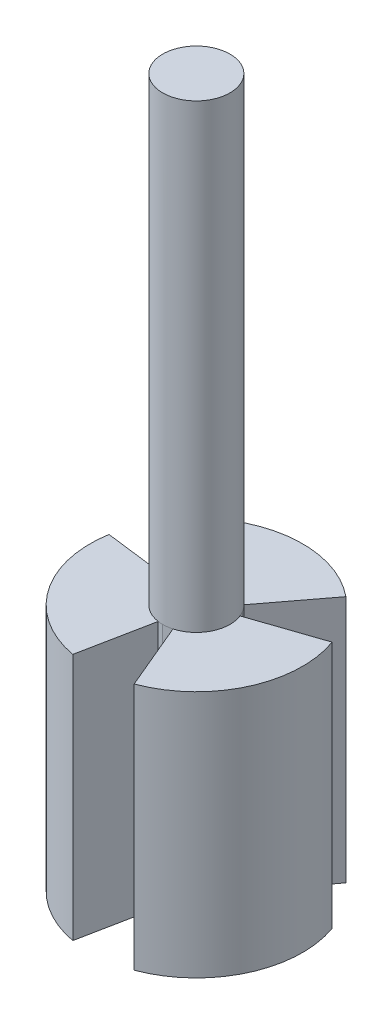
ISO-10303-21;
HEADER;
FILE_DESCRIPTION(('STEP AP214'),'2;1');
FILE_NAME('part.step','',(''),(''),'','','');
FILE_SCHEMA(('AUTOMOTIVE_DESIGN { 1 0 10303 214 1 1 1 1 }'));
ENDSEC;
DATA;
#1=APPLICATION_CONTEXT('core data for automotive mechanical design processes');
#2=APPLICATION_PROTOCOL_DEFINITION('international standard','automotive_design',2000,#1);
#3=PRODUCT_CONTEXT('',#1,'mechanical');
#4=PRODUCT('Part','Part','',(#3));
#5=PRODUCT_RELATED_PRODUCT_CATEGORY('part','',(#4));
#6=PRODUCT_DEFINITION_FORMATION('','',#4);
#7=PRODUCT_DEFINITION_CONTEXT('part definition',#1,'design');
#8=PRODUCT_DEFINITION('design','',#6,#7);
#9=PRODUCT_DEFINITION_SHAPE('','',#8);
#10=(LENGTH_UNIT() NAMED_UNIT(*) SI_UNIT(.MILLI.,.METRE.));
#11=(NAMED_UNIT(*) PLANE_ANGLE_UNIT() SI_UNIT($,.RADIAN.));
#12=(NAMED_UNIT(*) SI_UNIT($,.STERADIAN.) SOLID_ANGLE_UNIT());
#13=UNCERTAINTY_MEASURE_WITH_UNIT(LENGTH_MEASURE(1.E-05),#10,'distance_accuracy_value','');
#14=(GEOMETRIC_REPRESENTATION_CONTEXT(3) GLOBAL_UNCERTAINTY_ASSIGNED_CONTEXT((#13)) GLOBAL_UNIT_ASSIGNED_CONTEXT((#10,
#11,#12)) REPRESENTATION_CONTEXT('',''));
#15=CARTESIAN_POINT('',(0.,0.,0.));
#16=DIRECTION('',(0.,0.,1.));
#17=DIRECTION('',(1.,0.,0.));
#18=AXIS2_PLACEMENT_3D('',#15,#16,#17);
#19=CARTESIAN_POINT('',(0.,70.,0.));
#20=DIRECTION('',(0.,-1.,0.));
#21=DIRECTION('',(0.,0.,-1.));
#22=AXIS2_PLACEMENT_3D('',#19,#20,#21);
#23=CYLINDRICAL_SURFACE('',#22,30.);
#24=DIRECTION('',(0.,-1.,0.));
#25=VECTOR('',#24,1.);
#26=CARTESIAN_POINT('',(-22.8717471072358,70.,-19.4134794476068));
#27=LINE('',#26,#25);
#28=CARTESIAN_POINT('',(-22.8717471072358,70.,-19.4134794476068));
#29=VERTEX_POINT('',#28);
#30=CARTESIAN_POINT('',(-22.8717471072358,0.,-19.4134794476068));
#31=VERTEX_POINT('',#30);
#32=EDGE_CURVE('E239',#29,#31,#27,.T.);
#33=ORIENTED_EDGE('',*,*,#32,.F.);
#34=CARTESIAN_POINT('',(0.,70.,0.));
#35=DIRECTION('',(0.,-1.,0.));
#36=DIRECTION('',(0.,0.,-1.));
#37=AXIS2_PLACEMENT_3D('',#34,#35,#36);
#38=CIRCLE('',#37,30.);
#39=CARTESIAN_POINT('',(19.0618079007288,70.,-23.1656530137985));
#40=VERTEX_POINT('',#39);
#41=EDGE_CURVE('E294',#29,#40,#38,.T.);
#42=ORIENTED_EDGE('',*,*,#41,.T.);
#43=DIRECTION('',(0.,-1.,0.));
#44=VECTOR('',#43,1.);
#45=CARTESIAN_POINT('',(19.0618079007288,70.,-23.1656530137985));
#46=LINE('',#45,#44);
#47=CARTESIAN_POINT('',(19.0618079007288,0.,-23.1656530137985));
#48=VERTEX_POINT('',#47);
#49=EDGE_CURVE('E193',#48,#40,#46,.F.);
#50=ORIENTED_EDGE('',*,*,#49,.F.);
#51=CARTESIAN_POINT('',(0.,0.,0.));
#52=DIRECTION('',(0.,-1.,0.));
#53=DIRECTION('',(0.,0.,-1.));
#54=AXIS2_PLACEMENT_3D('',#51,#52,#53);
#55=CIRCLE('',#54,30.);
#56=EDGE_CURVE('E299',#31,#48,#55,.T.);
#57=ORIENTED_EDGE('',*,*,#56,.F.);
#58=EDGE_LOOP('',(#33,#42,#50,#57));
#59=FACE_BOUND('',#58,.T.);
#60=ADVANCED_FACE('F41',(#59),#23,.T.);
#61=DIRECTION('',(0.,-1.,0.));
#62=VECTOR('',#61,1.);
#63=CARTESIAN_POINT('',(28.2484399310925,70.,-10.1007742999959));
#64=LINE('',#63,#62);
#65=CARTESIAN_POINT('',(28.2484399310925,70.,-10.1007742999959));
#66=VERTEX_POINT('',#65);
#67=CARTESIAN_POINT('',(28.2484399310925,0.,-10.1007742999959));
#68=VERTEX_POINT('',#67);
#69=EDGE_CURVE('E233',#66,#68,#64,.T.);
#70=ORIENTED_EDGE('',*,*,#69,.F.);
#71=CARTESIAN_POINT('',(10.5311400548409,70.,28.0908363909892));
#72=VERTEX_POINT('',#71);
#73=EDGE_CURVE('E295',#66,#72,#38,.T.);
#74=ORIENTED_EDGE('',*,*,#73,.T.);
#75=DIRECTION('',(0.,-1.,0.));
#76=VECTOR('',#75,1.);
#77=CARTESIAN_POINT('',(10.5311400548409,70.,28.0908363909892));
#78=LINE('',#77,#76);
#79=CARTESIAN_POINT('',(10.5311400548409,0.,28.0908363909892));
#80=VERTEX_POINT('',#79);
#81=EDGE_CURVE('E274',#80,#72,#78,.F.);
#82=ORIENTED_EDGE('',*,*,#81,.F.);
#83=EDGE_CURVE('E288',#68,#80,#55,.T.);
#84=ORIENTED_EDGE('',*,*,#83,.F.);
#85=EDGE_LOOP('',(#70,#74,#82,#84));
#86=FACE_BOUND('',#85,.T.);
#87=ADVANCED_FACE('F331',(#86),#23,.T.);
#88=CARTESIAN_POINT('',(0.,70.,0.));
#89=DIRECTION('',(0.,-1.,0.));
#90=DIRECTION('',(0.,0.,-1.));
#91=AXIS2_PLACEMENT_3D('',#88,#89,#90);
#92=PLANE('',#91);
#93=ORIENTED_EDGE('',*,*,#41,.F.);
#94=DIRECTION('',(-0.752074153309713,0.,-0.659078499060225));
#95=VECTOR('',#94,1.);
#96=CARTESIAN_POINT('',(-24.9755906548965,70.,-21.2571780264605));
#97=LINE('',#96,#95);
#98=CARTESIAN_POINT('',(-7.44814705085686,70.,-5.8970420982737));
#99=VERTEX_POINT('',#98);
#100=EDGE_CURVE('E176',#99,#29,#97,.T.);
#101=ORIENTED_EDGE('',*,*,#100,.F.);
#102=CARTESIAN_POINT('',(0.,70.,0.));
#103=DIRECTION('',(0.,-1.,0.));
#104=DIRECTION('',(0.,0.,-1.));
#105=AXIS2_PLACEMENT_3D('',#102,#103,#104);
#106=CIRCLE('',#105,9.5);
#107=CARTESIAN_POINT('',(6.64739087220726,70.,-6.78691348052231));
#108=VERTEX_POINT('',#107);
#109=EDGE_CURVE('E352',#99,#108,#106,.T.);
#110=ORIENTED_EDGE('',*,*,#109,.T.);
#111=DIRECTION('',(-0.604051845839798,0.,0.79694502165302));
#112=VECTOR('',#111,1.);
#113=CARTESIAN_POINT('',(6.64739087220726,70.,-6.78691348052231));
#114=LINE('',#113,#112);
#115=EDGE_CURVE('E209',#40,#108,#114,.T.);
#116=ORIENTED_EDGE('',*,*,#115,.F.);
#117=EDGE_LOOP('',(#93,#101,#110,#116));
#118=FACE_BOUND('',#117,.T.);
#119=ADVANCED_FACE('F397',(#118),#92,.F.);
#120=ORIENTED_EDGE('',*,*,#73,.F.);
#121=DIRECTION('',(0.946815799929131,0.,-0.321776072765767));
#122=VECTOR('',#121,1.);
#123=CARTESIAN_POINT('',(30.8970515111315,70.,-11.0009069684312));
#124=LINE('',#123,#122);
#125=CARTESIAN_POINT('',(8.83106178971976,70.,-3.50176350802729));
#126=VERTEX_POINT('',#125);
#127=EDGE_CURVE('E200',#126,#66,#124,.T.);
#128=ORIENTED_EDGE('',*,*,#127,.F.);
#129=CARTESIAN_POINT('',(2.55394405131584,70.,9.15026610447742));
#130=VERTEX_POINT('',#129);
#131=EDGE_CURVE('E303',#126,#130,#106,.T.);
#132=ORIENTED_EDGE('',*,*,#131,.T.);
#133=DIRECTION('',(-0.388148711251165,0.,-0.921596754526653));
#134=VECTOR('',#133,1.);
#135=CARTESIAN_POINT('',(2.55394405131584,70.,9.15026610447742));
#136=LINE('',#135,#134);
#137=EDGE_CURVE('E242',#72,#130,#136,.T.);
#138=ORIENTED_EDGE('',*,*,#137,.F.);
#139=EDGE_LOOP('',(#120,#128,#132,#138));
#140=FACE_BOUND('',#139,.T.);
#141=ADVANCED_FACE('F340',(#140),#92,.F.);
#142=CARTESIAN_POINT('',(0.,200.,0.));
#143=DIRECTION('',(0.,-1.,0.));
#144=DIRECTION('',(0.,0.,-1.));
#145=AXIS2_PLACEMENT_3D('',#142,#143,#144);
#146=CYLINDRICAL_SURFACE('',#145,9.5);
#147=CARTESIAN_POINT('',(0.,200.,0.));
#148=DIRECTION('',(0.,1.,0.));
#149=DIRECTION('',(0.,0.,1.));
#150=AXIS2_PLACEMENT_3D('',#147,#148,#149);
#151=CIRCLE('',#150,9.5);
#152=CARTESIAN_POINT('',(0.,200.,9.5));
#153=VERTEX_POINT('',#152);
#154=EDGE_CURVE('E293',#153,#153,#151,.T.);
#155=ORIENTED_EDGE('',*,*,#154,.F.);
#156=EDGE_LOOP('',(#155));
#157=FACE_BOUND('',#156,.T.);
#158=CARTESIAN_POINT('',(0.,70.,9.5));
#159=VERTEX_POINT('',#158);
#160=EDGE_CURVE('E304',#130,#159,#106,.T.);
#161=ORIENTED_EDGE('',*,*,#160,.F.);
#162=ORIENTED_EDGE('',*,*,#131,.F.);
#163=CARTESIAN_POINT('',(8.22724133595221,70.,-4.74999999999992));
#164=VERTEX_POINT('',#163);
#165=EDGE_CURVE('E346',#164,#126,#106,.T.);
#166=ORIENTED_EDGE('',*,*,#165,.F.);
#167=EDGE_CURVE('E348',#108,#164,#106,.T.);
#168=ORIENTED_EDGE('',*,*,#167,.F.);
#169=ORIENTED_EDGE('',*,*,#109,.F.);
#170=CARTESIAN_POINT('',(-8.22724133595214,70.,-4.75000000000004));
#171=VERTEX_POINT('',#170);
#172=EDGE_CURVE('E358',#171,#99,#106,.T.);
#173=ORIENTED_EDGE('',*,*,#172,.F.);
#174=CARTESIAN_POINT('',(-9.20133492352303,70.,-2.36335262395509));
#175=VERTEX_POINT('',#174);
#176=EDGE_CURVE('E361',#175,#171,#106,.T.);
#177=ORIENTED_EDGE('',*,*,#176,.F.);
#178=CARTESIAN_POINT('',(-1.38291473886284,70.,9.39880560630104));
#179=VERTEX_POINT('',#178);
#180=EDGE_CURVE('E364',#179,#175,#106,.T.);
#181=ORIENTED_EDGE('',*,*,#180,.F.);
#182=EDGE_CURVE('E308',#159,#179,#106,.T.);
#183=ORIENTED_EDGE('',*,*,#182,.F.);
#184=EDGE_LOOP('',(#161,#162,#166,#168,#169,#173,#177,#181,#183));
#185=FACE_BOUND('',#184,.T.);
#186=ADVANCED_FACE('F43',(#157,#185),#146,.T.);
#187=CARTESIAN_POINT('',(0.,200.,0.));
#188=DIRECTION('',(0.,1.,0.));
#189=DIRECTION('',(0.,0.,1.));
#190=AXIS2_PLACEMENT_3D('',#187,#188,#189);
#191=PLANE('',#190);
#192=ORIENTED_EDGE('',*,*,#154,.T.);
#193=EDGE_LOOP('',(#192));
#194=FACE_BOUND('',#193,.T.);
#195=ADVANCED_FACE('F388',(#194),#191,.T.);
#196=DIRECTION('',(0.,-1.,0.));
#197=VECTOR('',#196,1.);
#198=CARTESIAN_POINT('',(-29.5929479555695,70.,-4.9251833771907));
#199=LINE('',#198,#197);
#200=CARTESIAN_POINT('',(-29.5929479555695,0.,-4.9251833771907));
#201=VERTEX_POINT('',#200);
#202=CARTESIAN_POINT('',(-29.5929479555695,70.,-4.9251833771907));
#203=VERTEX_POINT('',#202);
#204=EDGE_CURVE('E236',#201,#203,#199,.F.);
#205=ORIENTED_EDGE('',*,*,#204,.F.);
#206=CARTESIAN_POINT('',(-5.37669282385651,0.,29.5142537476029));
#207=VERTEX_POINT('',#206);
#208=EDGE_CURVE('E296',#207,#201,#55,.T.);
#209=ORIENTED_EDGE('',*,*,#208,.F.);
#210=DIRECTION('',(0.,-1.,0.));
#211=VECTOR('',#210,1.);
#212=CARTESIAN_POINT('',(-5.37669282385651,70.,29.5142537476029));
#213=LINE('',#212,#211);
#214=CARTESIAN_POINT('',(-5.37669282385651,70.,29.5142537476029));
#215=VERTEX_POINT('',#214);
#216=EDGE_CURVE('E285',#215,#207,#213,.T.);
#217=ORIENTED_EDGE('',*,*,#216,.F.);
#218=EDGE_CURVE('E289',#215,#203,#38,.T.);
#219=ORIENTED_EDGE('',*,*,#218,.T.);
#220=EDGE_LOOP('',(#205,#209,#217,#219));
#221=FACE_BOUND('',#220,.T.);
#222=ADVANCED_FACE('F394',(#221),#23,.T.);
#223=ORIENTED_EDGE('',*,*,#180,.T.);
#224=DIRECTION('',(0.992200557090955,0.,0.124651732873631));
#225=VECTOR('',#224,1.);
#226=CARTESIAN_POINT('',(-9.20133492352303,70.,-2.36335262395509));
#227=LINE('',#226,#225);
#228=EDGE_CURVE('E184',#203,#175,#227,.T.);
#229=ORIENTED_EDGE('',*,*,#228,.F.);
#230=ORIENTED_EDGE('',*,*,#218,.F.);
#231=DIRECTION('',(-0.194741646619412,0.,0.980854571825997));
#232=VECTOR('',#231,1.);
#233=CARTESIAN_POINT('',(-5.92146085623477,70.,32.2580849948919));
#234=LINE('',#233,#232);
#235=EDGE_CURVE('E248',#179,#215,#234,.T.);
#236=ORIENTED_EDGE('',*,*,#235,.F.);
#237=EDGE_LOOP('',(#223,#229,#230,#236));
#238=FACE_BOUND('',#237,.T.);
#239=ADVANCED_FACE('F386',(#238),#92,.F.);
#240=CARTESIAN_POINT('',(0.,0.,0.));
#241=DIRECTION('',(0.,1.,0.));
#242=DIRECTION('',(0.,0.,1.));
#243=AXIS2_PLACEMENT_3D('',#240,#241,#242);
#244=PLANE('',#243);
#245=DIRECTION('',(0.561868897050058,0.,-0.827226294630286));
#246=VECTOR('',#245,1.);
#247=CARTESIAN_POINT('',(-7.44814705085686,0.,-5.8970420982737));
#248=LINE('',#247,#246);
#249=CARTESIAN_POINT('',(-8.22724133595214,0.,-4.75000000000004));
#250=VERTEX_POINT('',#249);
#251=CARTESIAN_POINT('',(-7.44814705085686,0.,-5.8970420982737));
#252=VERTEX_POINT('',#251);
#253=EDGE_CURVE('E164',#250,#252,#248,.T.);
#254=ORIENTED_EDGE('',*,*,#253,.T.);
#255=DIRECTION('',(-0.752074153309713,0.,-0.659078499060225));
#256=VECTOR('',#255,1.);
#257=CARTESIAN_POINT('',(-24.9755906548965,0.,-21.2571780264605));
#258=LINE('',#257,#256);
#259=EDGE_CURVE('E171',#252,#31,#258,.T.);
#260=ORIENTED_EDGE('',*,*,#259,.T.);
#261=ORIENTED_EDGE('',*,*,#56,.T.);
#262=DIRECTION('',(-0.604051845839798,0.,0.796945021653021));
#263=VECTOR('',#262,1.);
#264=CARTESIAN_POINT('',(0.954706223636675,0.,0.723628407172058));
#265=LINE('',#264,#263);
#266=CARTESIAN_POINT('',(6.64739087220726,0.,-6.78691348052232));
#267=VERTEX_POINT('',#266);
#268=EDGE_CURVE('E50',#48,#267,#265,.T.);
#269=ORIENTED_EDGE('',*,*,#268,.T.);
#270=DIRECTION('',(0.612872759870946,0.,0.790181612167842));
#271=VECTOR('',#270,1.);
#272=CARTESIAN_POINT('',(8.22724133595221,0.,-4.74999999999992));
#273=LINE('',#272,#271);
#274=CARTESIAN_POINT('',(8.22724133595221,0.,-4.74999999999992));
#275=VERTEX_POINT('',#274);
#276=EDGE_CURVE('E65',#267,#275,#273,.T.);
#277=ORIENTED_EDGE('',*,*,#276,.T.);
#278=DIRECTION('',(0.435464537303265,0.,0.900205885756838));
#279=VECTOR('',#278,1.);
#280=CARTESIAN_POINT('',(8.83106178971976,0.,-3.50176350802729));
#281=LINE('',#280,#279);
#282=CARTESIAN_POINT('',(8.83106178971976,0.,-3.50176350802729));
#283=VERTEX_POINT('',#282);
#284=EDGE_CURVE('E199',#275,#283,#281,.T.);
#285=ORIENTED_EDGE('',*,*,#284,.T.);
#286=DIRECTION('',(0.946815799929131,0.,-0.321776072765767));
#287=VECTOR('',#286,1.);
#288=CARTESIAN_POINT('',(30.8970515111315,0.,-11.0009069684312));
#289=LINE('',#288,#287);
#290=EDGE_CURVE('E204',#283,#68,#289,.T.);
#291=ORIENTED_EDGE('',*,*,#290,.T.);
#292=ORIENTED_EDGE('',*,*,#83,.T.);
#293=DIRECTION('',(-0.388148711251165,0.,-0.921596754526653));
#294=VECTOR('',#293,1.);
#295=CARTESIAN_POINT('',(-1.1040336953294,0.,0.46498563923445));
#296=LINE('',#295,#294);
#297=CARTESIAN_POINT('',(2.55394405131584,0.,9.15026610447742));
#298=VERTEX_POINT('',#297);
#299=EDGE_CURVE('E307',#80,#298,#296,.T.);
#300=ORIENTED_EDGE('',*,*,#299,.T.);
#301=DIRECTION('',(-0.990753729676166,0.,0.135672573251808));
#302=VECTOR('',#301,1.);
#303=CARTESIAN_POINT('',(0.,0.,9.5));
#304=LINE('',#303,#302);
#305=CARTESIAN_POINT('',(0.,0.,9.5));
#306=VERTEX_POINT('',#305);
#307=EDGE_CURVE('E243',#298,#306,#304,.T.);
#308=ORIENTED_EDGE('',*,*,#307,.T.);
#309=DIRECTION('',(-0.997333434353327,0.,-0.0729795911265458));
#310=VECTOR('',#309,1.);
#311=CARTESIAN_POINT('',(-1.38291473886284,0.,9.39880560630104));
#312=LINE('',#311,#310);
#313=CARTESIAN_POINT('',(-1.38291473886284,0.,9.39880560630104));
#314=VERTEX_POINT('',#313);
#315=EDGE_CURVE('E247',#306,#314,#312,.T.);
#316=ORIENTED_EDGE('',*,*,#315,.T.);
#317=DIRECTION('',(-0.194741646619412,0.,0.980854571825997));
#318=VECTOR('',#317,1.);
#319=CARTESIAN_POINT('',(-5.92146085623477,0.,32.2580849948919));
#320=LINE('',#319,#318);
#321=EDGE_CURVE('E252',#314,#207,#320,.T.);
#322=ORIENTED_EDGE('',*,*,#321,.T.);
#323=ORIENTED_EDGE('',*,*,#208,.T.);
#324=DIRECTION('',(0.992200557090955,0.,0.124651732873631));
#325=VECTOR('',#324,1.);
#326=CARTESIAN_POINT('',(0.149327471692728,0.,-1.1886140464065));
#327=LINE('',#326,#325);
#328=CARTESIAN_POINT('',(-9.20133492352303,0.,-2.36335262395509));
#329=VERTEX_POINT('',#328);
#330=EDGE_CURVE('E11',#201,#329,#327,.T.);
#331=ORIENTED_EDGE('',*,*,#330,.T.);
#332=DIRECTION('',(0.377880969805216,0.,-0.925854185419642));
#333=VECTOR('',#332,1.);
#334=CARTESIAN_POINT('',(-8.22724133595214,0.,-4.75000000000004));
#335=LINE('',#334,#333);
#336=EDGE_CURVE('E57',#329,#250,#335,.T.);
#337=ORIENTED_EDGE('',*,*,#336,.T.);
#338=EDGE_LOOP('',(#254,#260,#261,#269,#277,#285,#291,#292,#300,#308,#316,#322,#323,#331,#337));
#339=FACE_BOUND('',#338,.T.);
#340=ADVANCED_FACE('F173',(#339),#244,.F.);
#341=CARTESIAN_POINT('',(0.,70.,0.));
#342=DIRECTION('',(0.,1.,0.));
#343=DIRECTION('',(0.,0.,1.));
#344=AXIS2_PLACEMENT_3D('',#341,#342,#343);
#345=PLANE('',#344);
#346=DIRECTION('',(-0.990753729676166,0.,0.135672573251808));
#347=VECTOR('',#346,1.);
#348=CARTESIAN_POINT('',(0.,70.,9.5));
#349=LINE('',#348,#347);
#350=EDGE_CURVE('E260',#130,#159,#349,.T.);
#351=ORIENTED_EDGE('',*,*,#350,.F.);
#352=ORIENTED_EDGE('',*,*,#160,.T.);
#353=EDGE_LOOP('',(#351,#352));
#354=FACE_BOUND('',#353,.T.);
#355=ADVANCED_FACE('F417',(#354),#345,.F.);
#356=DIRECTION('',(-0.997333434353327,0.,-0.0729795911265458));
#357=VECTOR('',#356,1.);
#358=CARTESIAN_POINT('',(-1.38291473886284,70.,9.39880560630104));
#359=LINE('',#358,#357);
#360=EDGE_CURVE('E264',#159,#179,#359,.T.);
#361=ORIENTED_EDGE('',*,*,#360,.F.);
#362=ORIENTED_EDGE('',*,*,#182,.T.);
#363=EDGE_LOOP('',(#361,#362));
#364=FACE_BOUND('',#363,.T.);
#365=ADVANCED_FACE('F377',(#364),#345,.F.);
#366=CARTESIAN_POINT('',(-5.92146085623477,0.,32.2580849948919));
#367=DIRECTION('',(-0.980854571825997,0.,-0.194741646619412));
#368=DIRECTION('',(-0.194741646619412,0.,0.980854571825997));
#369=AXIS2_PLACEMENT_3D('',#366,#367,#368);
#370=PLANE('',#369);
#371=ORIENTED_EDGE('',*,*,#216,.T.);
#372=ORIENTED_EDGE('',*,*,#321,.F.);
#373=DIRECTION('',(0.,1.,0.));
#374=VECTOR('',#373,1.);
#375=CARTESIAN_POINT('',(-1.38291473886284,0.,9.39880560630104));
#376=LINE('',#375,#374);
#377=EDGE_CURVE('E270',#314,#179,#376,.T.);
#378=ORIENTED_EDGE('',*,*,#377,.T.);
#379=ORIENTED_EDGE('',*,*,#235,.T.);
#380=EDGE_LOOP('',(#371,#372,#378,#379));
#381=FACE_BOUND('',#380,.T.);
#382=ADVANCED_FACE('F380',(#381),#370,.F.);
#383=CARTESIAN_POINT('',(-1.38291473886284,0.,9.39880560630104));
#384=DIRECTION('',(0.0729795911265458,0.,-0.997333434353327));
#385=DIRECTION('',(-0.997333434353327,0.,-0.0729795911265458));
#386=AXIS2_PLACEMENT_3D('',#383,#384,#385);
#387=PLANE('',#386);
#388=ORIENTED_EDGE('',*,*,#360,.T.);
#389=ORIENTED_EDGE('',*,*,#377,.F.);
#390=ORIENTED_EDGE('',*,*,#315,.F.);
#391=DIRECTION('',(0.,1.,0.));
#392=VECTOR('',#391,1.);
#393=CARTESIAN_POINT('',(0.,0.,9.5));
#394=LINE('',#393,#392);
#395=EDGE_CURVE('E275',#306,#159,#394,.T.);
#396=ORIENTED_EDGE('',*,*,#395,.T.);
#397=EDGE_LOOP('',(#388,#389,#390,#396));
#398=FACE_BOUND('',#397,.T.);
#399=ADVANCED_FACE('F384',(#398),#387,.F.);
#400=CARTESIAN_POINT('',(0.,0.,9.5));
#401=DIRECTION('',(-0.135672573251808,0.,-0.990753729676166));
#402=DIRECTION('',(-0.990753729676166,0.,0.135672573251808));
#403=AXIS2_PLACEMENT_3D('',#400,#401,#402);
#404=PLANE('',#403);
#405=ORIENTED_EDGE('',*,*,#350,.T.);
#406=ORIENTED_EDGE('',*,*,#395,.F.);
#407=ORIENTED_EDGE('',*,*,#307,.F.);
#408=DIRECTION('',(0.,1.,0.));
#409=VECTOR('',#408,1.);
#410=CARTESIAN_POINT('',(2.55394405131584,0.,9.15026610447742));
#411=LINE('',#410,#409);
#412=EDGE_CURVE('E256',#298,#130,#411,.T.);
#413=ORIENTED_EDGE('',*,*,#412,.T.);
#414=EDGE_LOOP('',(#405,#406,#407,#413));
#415=FACE_BOUND('',#414,.T.);
#416=ADVANCED_FACE('F414',(#415),#404,.F.);
#417=CARTESIAN_POINT('',(2.55394405131584,0.,9.15026610447742));
#418=DIRECTION('',(0.921596754526653,0.,-0.388148711251165));
#419=DIRECTION('',(-0.388148711251165,0.,-0.921596754526653));
#420=AXIS2_PLACEMENT_3D('',#417,#418,#419);
#421=PLANE('',#420);
#422=ORIENTED_EDGE('',*,*,#81,.T.);
#423=ORIENTED_EDGE('',*,*,#137,.T.);
#424=ORIENTED_EDGE('',*,*,#412,.F.);
#425=ORIENTED_EDGE('',*,*,#299,.F.);
#426=EDGE_LOOP('',(#422,#423,#424,#425));
#427=FACE_BOUND('',#426,.T.);
#428=ADVANCED_FACE('F338',(#427),#421,.F.);
#429=CARTESIAN_POINT('',(0.,70.,0.));
#430=DIRECTION('',(0.,1.,0.));
#431=DIRECTION('',(0.866025403784443,0.,-0.499999999999992));
#432=AXIS2_PLACEMENT_3D('',#429,#430,#431);
#433=PLANE('',#432);
#434=DIRECTION('',(0.435464537303265,0.,0.900205885756838));
#435=VECTOR('',#434,1.);
#436=CARTESIAN_POINT('',(8.83106178971976,70.,-3.50176350802729));
#437=LINE('',#436,#435);
#438=EDGE_CURVE('E216',#164,#126,#437,.T.);
#439=ORIENTED_EDGE('',*,*,#438,.F.);
#440=ORIENTED_EDGE('',*,*,#165,.T.);
#441=EDGE_LOOP('',(#439,#440));
#442=FACE_BOUND('',#441,.T.);
#443=ADVANCED_FACE('F434',(#442),#433,.F.);
#444=DIRECTION('',(0.612872759870946,0.,0.790181612167842));
#445=VECTOR('',#444,1.);
#446=CARTESIAN_POINT('',(8.22724133595221,70.,-4.74999999999992));
#447=LINE('',#446,#445);
#448=EDGE_CURVE('E212',#108,#164,#447,.T.);
#449=ORIENTED_EDGE('',*,*,#448,.F.);
#450=ORIENTED_EDGE('',*,*,#167,.T.);
#451=EDGE_LOOP('',(#449,#450));
#452=FACE_BOUND('',#451,.T.);
#453=ADVANCED_FACE('F438',(#452),#433,.F.);
#454=CARTESIAN_POINT('',(30.8970515111315,0.,-11.0009069684312));
#455=DIRECTION('',(0.321776072765767,0.,0.946815799929131));
#456=DIRECTION('',(0.946815799929131,0.,-0.321776072765767));
#457=AXIS2_PLACEMENT_3D('',#454,#455,#456);
#458=PLANE('',#457);
#459=ORIENTED_EDGE('',*,*,#69,.T.);
#460=ORIENTED_EDGE('',*,*,#290,.F.);
#461=DIRECTION('',(0.,1.,0.));
#462=VECTOR('',#461,1.);
#463=CARTESIAN_POINT('',(8.83106178971976,0.,-3.50176350802729));
#464=LINE('',#463,#462);
#465=EDGE_CURVE('E187',#283,#126,#464,.T.);
#466=ORIENTED_EDGE('',*,*,#465,.T.);
#467=ORIENTED_EDGE('',*,*,#127,.T.);
#468=EDGE_LOOP('',(#459,#460,#466,#467));
#469=FACE_BOUND('',#468,.T.);
#470=ADVANCED_FACE('F443',(#469),#458,.F.);
#471=CARTESIAN_POINT('',(8.83106178971976,0.,-3.50176350802729));
#472=DIRECTION('',(-0.900205885756838,0.,0.435464537303265));
#473=DIRECTION('',(0.435464537303265,0.,0.900205885756838));
#474=AXIS2_PLACEMENT_3D('',#471,#472,#473);
#475=PLANE('',#474);
#476=ORIENTED_EDGE('',*,*,#438,.T.);
#477=ORIENTED_EDGE('',*,*,#465,.F.);
#478=ORIENTED_EDGE('',*,*,#284,.F.);
#479=DIRECTION('',(0.,1.,0.));
#480=VECTOR('',#479,1.);
#481=CARTESIAN_POINT('',(8.22724133595221,0.,-4.74999999999992));
#482=LINE('',#481,#480);
#483=EDGE_CURVE('E225',#275,#164,#482,.T.);
#484=ORIENTED_EDGE('',*,*,#483,.T.);
#485=EDGE_LOOP('',(#476,#477,#478,#484));
#486=FACE_BOUND('',#485,.T.);
#487=ADVANCED_FACE('F450',(#486),#475,.F.);
#488=CARTESIAN_POINT('',(8.22724133595221,0.,-4.74999999999992));
#489=DIRECTION('',(-0.790181612167842,0.,0.612872759870946));
#490=DIRECTION('',(0.612872759870946,0.,0.790181612167842));
#491=AXIS2_PLACEMENT_3D('',#488,#489,#490);
#492=PLANE('',#491);
#493=ORIENTED_EDGE('',*,*,#448,.T.);
#494=ORIENTED_EDGE('',*,*,#483,.F.);
#495=ORIENTED_EDGE('',*,*,#276,.F.);
#496=DIRECTION('',(0.,1.,0.));
#497=VECTOR('',#496,1.);
#498=CARTESIAN_POINT('',(6.64739087220726,0.,-6.78691348052231));
#499=LINE('',#498,#497);
#500=EDGE_CURVE('E208',#267,#108,#499,.T.);
#501=ORIENTED_EDGE('',*,*,#500,.T.);
#502=EDGE_LOOP('',(#493,#494,#495,#501));
#503=FACE_BOUND('',#502,.T.);
#504=ADVANCED_FACE('F453',(#503),#492,.F.);
#505=CARTESIAN_POINT('',(6.64739087220726,0.,-6.78691348052231));
#506=DIRECTION('',(-0.796945021653021,0.,-0.604051845839798));
#507=DIRECTION('',(-0.604051845839798,0.,0.796945021653021));
#508=AXIS2_PLACEMENT_3D('',#505,#506,#507);
#509=PLANE('',#508);
#510=ORIENTED_EDGE('',*,*,#49,.T.);
#511=ORIENTED_EDGE('',*,*,#115,.T.);
#512=ORIENTED_EDGE('',*,*,#500,.F.);
#513=ORIENTED_EDGE('',*,*,#268,.F.);
#514=EDGE_LOOP('',(#510,#511,#512,#513));
#515=FACE_BOUND('',#514,.T.);
#516=ADVANCED_FACE('F317',(#515),#509,.F.);
#517=CARTESIAN_POINT('',(0.,70.,0.));
#518=DIRECTION('',(0.,1.,0.));
#519=DIRECTION('',(-0.866025403784436,0.,-0.500000000000004));
#520=AXIS2_PLACEMENT_3D('',#517,#518,#519);
#521=PLANE('',#520);
#522=DIRECTION('',(0.561868897050058,0.,-0.827226294630286));
#523=VECTOR('',#522,1.);
#524=CARTESIAN_POINT('',(-7.44814705085686,70.,-5.8970420982737));
#525=LINE('',#524,#523);
#526=EDGE_CURVE('E179',#171,#99,#525,.T.);
#527=ORIENTED_EDGE('',*,*,#526,.F.);
#528=ORIENTED_EDGE('',*,*,#172,.T.);
#529=EDGE_LOOP('',(#527,#528));
#530=FACE_BOUND('',#529,.T.);
#531=ADVANCED_FACE('F459',(#530),#521,.F.);
#532=DIRECTION('',(0.377880969805216,0.,-0.925854185419642));
#533=VECTOR('',#532,1.);
#534=CARTESIAN_POINT('',(-8.22724133595214,70.,-4.75000000000004));
#535=LINE('',#534,#533);
#536=EDGE_CURVE('E154',#175,#171,#535,.T.);
#537=ORIENTED_EDGE('',*,*,#536,.F.);
#538=ORIENTED_EDGE('',*,*,#176,.T.);
#539=EDGE_LOOP('',(#537,#538));
#540=FACE_BOUND('',#539,.T.);
#541=ADVANCED_FACE('F467',(#540),#521,.F.);
#542=CARTESIAN_POINT('',(-24.9755906548965,0.,-21.2571780264605));
#543=DIRECTION('',(0.659078499060225,0.,-0.752074153309713));
#544=DIRECTION('',(-0.752074153309713,0.,-0.659078499060225));
#545=AXIS2_PLACEMENT_3D('',#542,#543,#544);
#546=PLANE('',#545);
#547=ORIENTED_EDGE('',*,*,#32,.T.);
#548=ORIENTED_EDGE('',*,*,#259,.F.);
#549=DIRECTION('',(0.,1.,0.));
#550=VECTOR('',#549,1.);
#551=CARTESIAN_POINT('',(-7.44814705085686,0.,-5.8970420982737));
#552=LINE('',#551,#550);
#553=EDGE_CURVE('E160',#252,#99,#552,.T.);
#554=ORIENTED_EDGE('',*,*,#553,.T.);
#555=ORIENTED_EDGE('',*,*,#100,.T.);
#556=EDGE_LOOP('',(#547,#548,#554,#555));
#557=FACE_BOUND('',#556,.T.);
#558=ADVANCED_FACE('F472',(#557),#546,.F.);
#559=CARTESIAN_POINT('',(-7.44814705085686,0.,-5.8970420982737));
#560=DIRECTION('',(0.827226294630285,0.,0.561868897050057));
#561=DIRECTION('',(0.561868897050058,0.,-0.827226294630286));
#562=AXIS2_PLACEMENT_3D('',#559,#560,#561);
#563=PLANE('',#562);
#564=ORIENTED_EDGE('',*,*,#526,.T.);
#565=ORIENTED_EDGE('',*,*,#553,.F.);
#566=ORIENTED_EDGE('',*,*,#253,.F.);
#567=DIRECTION('',(0.,1.,0.));
#568=VECTOR('',#567,1.);
#569=CARTESIAN_POINT('',(-8.22724133595214,0.,-4.75000000000004));
#570=LINE('',#569,#568);
#571=EDGE_CURVE('E150',#250,#171,#570,.T.);
#572=ORIENTED_EDGE('',*,*,#571,.T.);
#573=EDGE_LOOP('',(#564,#565,#566,#572));
#574=FACE_BOUND('',#573,.T.);
#575=ADVANCED_FACE('F165',(#574),#563,.F.);
#576=CARTESIAN_POINT('',(-8.22724133595214,0.,-4.75000000000004));
#577=DIRECTION('',(0.925854185419642,0.,0.377880969805216));
#578=DIRECTION('',(0.377880969805216,0.,-0.925854185419642));
#579=AXIS2_PLACEMENT_3D('',#576,#577,#578);
#580=PLANE('',#579);
#581=ORIENTED_EDGE('',*,*,#536,.T.);
#582=ORIENTED_EDGE('',*,*,#571,.F.);
#583=ORIENTED_EDGE('',*,*,#336,.F.);
#584=DIRECTION('',(0.,1.,0.));
#585=VECTOR('',#584,1.);
#586=CARTESIAN_POINT('',(-9.20133492352303,0.,-2.36335262395509));
#587=LINE('',#586,#585);
#588=EDGE_CURVE('E161',#329,#175,#587,.T.);
#589=ORIENTED_EDGE('',*,*,#588,.T.);
#590=EDGE_LOOP('',(#581,#582,#583,#589));
#591=FACE_BOUND('',#590,.T.);
#592=ADVANCED_FACE('F152',(#591),#580,.F.);
#593=CARTESIAN_POINT('',(-9.20133492352303,0.,-2.36335262395509));
#594=DIRECTION('',(-0.124651732873631,0.,0.992200557090955));
#595=DIRECTION('',(0.992200557090955,0.,0.124651732873631));
#596=AXIS2_PLACEMENT_3D('',#593,#594,#595);
#597=PLANE('',#596);
#598=ORIENTED_EDGE('',*,*,#204,.T.);
#599=ORIENTED_EDGE('',*,*,#228,.T.);
#600=ORIENTED_EDGE('',*,*,#588,.F.);
#601=ORIENTED_EDGE('',*,*,#330,.F.);
#602=EDGE_LOOP('',(#598,#599,#600,#601));
#603=FACE_BOUND('',#602,.T.);
#604=ADVANCED_FACE('F446',(#603),#597,.F.);
#605=CLOSED_SHELL('',(#60,#87,#119,#141,#186,#195,#222,#239,#340,#355,#365,#382,#399,#416,#428,
#443,#453,#470,#487,#504,#516,#531,#541,#558,#575,#592,#604));
#606=MANIFOLD_SOLID_BREP('B2',#605);
#607=ADVANCED_BREP_SHAPE_REPRESENTATION('',(#18,#606),#14);
#608=SHAPE_DEFINITION_REPRESENTATION(#9,#607);
ENDSEC;
END-ISO-10303-21;
